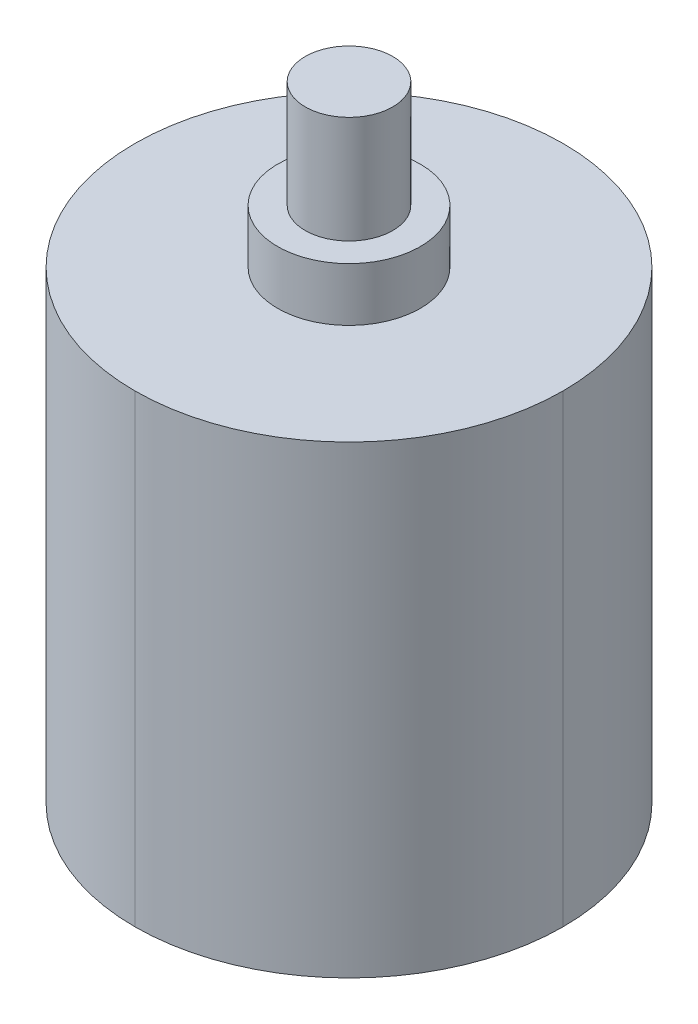
ISO-10303-21;
HEADER;
FILE_DESCRIPTION(('STEP AP214'),'2;1');
FILE_NAME('part.step','',(''),(''),'','','');
FILE_SCHEMA(('AUTOMOTIVE_DESIGN { 1 0 10303 214 1 1 1 1 }'));
ENDSEC;
DATA;
#1=APPLICATION_CONTEXT('core data for automotive mechanical design processes');
#2=APPLICATION_PROTOCOL_DEFINITION('international standard','automotive_design',2000,#1);
#3=PRODUCT_CONTEXT('',#1,'mechanical');
#4=PRODUCT('Part','Part','',(#3));
#5=PRODUCT_RELATED_PRODUCT_CATEGORY('part','',(#4));
#6=PRODUCT_DEFINITION_FORMATION('','',#4);
#7=PRODUCT_DEFINITION_CONTEXT('part definition',#1,'design');
#8=PRODUCT_DEFINITION('design','',#6,#7);
#9=PRODUCT_DEFINITION_SHAPE('','',#8);
#10=(LENGTH_UNIT() NAMED_UNIT(*) SI_UNIT(.MILLI.,.METRE.));
#11=(NAMED_UNIT(*) PLANE_ANGLE_UNIT() SI_UNIT($,.RADIAN.));
#12=(NAMED_UNIT(*) SI_UNIT($,.STERADIAN.) SOLID_ANGLE_UNIT());
#13=UNCERTAINTY_MEASURE_WITH_UNIT(LENGTH_MEASURE(1.E-05),#10,'distance_accuracy_value','');
#14=(GEOMETRIC_REPRESENTATION_CONTEXT(3) GLOBAL_UNCERTAINTY_ASSIGNED_CONTEXT((#13)) GLOBAL_UNIT_ASSIGNED_CONTEXT((#10,
#11,#12)) REPRESENTATION_CONTEXT('',''));
#15=CARTESIAN_POINT('',(0.,0.,0.));
#16=DIRECTION('',(0.,0.,1.));
#17=DIRECTION('',(1.,0.,0.));
#18=AXIS2_PLACEMENT_3D('',#15,#16,#17);
#19=CARTESIAN_POINT('',(0.,33.02,0.));
#20=DIRECTION('',(0.,1.,0.));
#21=DIRECTION('',(0.,0.,1.));
#22=AXIS2_PLACEMENT_3D('',#19,#20,#21);
#23=PLANE('',#22);
#24=CARTESIAN_POINT('',(-15.24,33.02,-15.24));
#25=DIRECTION('',(0.,1.,0.));
#26=DIRECTION('',(0.,0.,1.));
#27=AXIS2_PLACEMENT_3D('',#24,#25,#26);
#28=CIRCLE('',#27,5.08);
#29=CARTESIAN_POINT('',(-15.24,33.02,-20.32));
#30=VERTEX_POINT('',#29);
#31=EDGE_CURVE('E137',#30,#30,#28,.T.);
#32=ORIENTED_EDGE('',*,*,#31,.F.);
#33=EDGE_LOOP('',(#32));
#34=FACE_BOUND('',#33,.T.);
#35=CARTESIAN_POINT('',(-15.24,33.02,-15.24));
#36=DIRECTION('',(0.,1.,0.));
#37=DIRECTION('',(0.,0.,1.));
#38=AXIS2_PLACEMENT_3D('',#35,#36,#37);
#39=CIRCLE('',#38,15.24);
#40=CARTESIAN_POINT('',(0.,33.02,-15.24));
#41=VERTEX_POINT('',#40);
#42=CARTESIAN_POINT('',(-15.24,33.02,-30.48));
#43=VERTEX_POINT('',#42);
#44=EDGE_CURVE('E55',#41,#43,#39,.T.);
#45=ORIENTED_EDGE('',*,*,#44,.T.);
#46=CARTESIAN_POINT('',(-15.24,33.02,-15.24));
#47=DIRECTION('',(0.,1.,0.));
#48=DIRECTION('',(0.,0.,1.));
#49=AXIS2_PLACEMENT_3D('',#46,#47,#48);
#50=CIRCLE('',#49,15.24);
#51=CARTESIAN_POINT('',(-30.48,33.02,-15.24));
#52=VERTEX_POINT('',#51);
#53=EDGE_CURVE('E11',#43,#52,#50,.T.);
#54=ORIENTED_EDGE('',*,*,#53,.T.);
#55=CARTESIAN_POINT('',(-15.24,33.02,-15.24));
#56=DIRECTION('',(0.,1.,0.));
#57=DIRECTION('',(0.,0.,1.));
#58=AXIS2_PLACEMENT_3D('',#55,#56,#57);
#59=CIRCLE('',#58,15.24);
#60=CARTESIAN_POINT('',(-15.24,33.02,0.));
#61=VERTEX_POINT('',#60);
#62=EDGE_CURVE('E62',#52,#61,#59,.T.);
#63=ORIENTED_EDGE('',*,*,#62,.T.);
#64=CARTESIAN_POINT('',(-15.24,33.02,-15.24));
#65=DIRECTION('',(0.,1.,0.));
#66=DIRECTION('',(0.,0.,1.));
#67=AXIS2_PLACEMENT_3D('',#64,#65,#66);
#68=CIRCLE('',#67,15.24);
#69=EDGE_CURVE('E130',#61,#41,#68,.T.);
#70=ORIENTED_EDGE('',*,*,#69,.T.);
#71=EDGE_LOOP('',(#45,#54,#63,#70));
#72=FACE_BOUND('',#71,.T.);
#73=ADVANCED_FACE('F45',(#34,#72),#23,.T.);
#74=CARTESIAN_POINT('',(0.,0.,0.));
#75=DIRECTION('',(0.,1.,0.));
#76=DIRECTION('',(0.,0.,1.));
#77=AXIS2_PLACEMENT_3D('',#74,#75,#76);
#78=PLANE('',#77);
#79=CARTESIAN_POINT('',(-15.24,0.,-15.24));
#80=DIRECTION('',(0.,-1.,0.));
#81=DIRECTION('',(0.,0.,-1.));
#82=AXIS2_PLACEMENT_3D('',#79,#80,#81);
#83=CIRCLE('',#82,10.8585);
#84=CARTESIAN_POINT('',(-15.24,0.,-26.0985));
#85=VERTEX_POINT('',#84);
#86=EDGE_CURVE('E113',#85,#85,#83,.T.);
#87=ORIENTED_EDGE('',*,*,#86,.F.);
#88=EDGE_LOOP('',(#87));
#89=FACE_BOUND('',#88,.T.);
#90=CARTESIAN_POINT('',(-15.24,0.,-15.24));
#91=DIRECTION('',(0.,1.,0.));
#92=DIRECTION('',(0.,0.,1.));
#93=AXIS2_PLACEMENT_3D('',#90,#91,#92);
#94=CIRCLE('',#93,15.24);
#95=CARTESIAN_POINT('',(-15.24,0.,0.));
#96=VERTEX_POINT('',#95);
#97=CARTESIAN_POINT('',(-30.48,0.,-15.24));
#98=VERTEX_POINT('',#97);
#99=EDGE_CURVE('E100',#96,#98,#94,.F.);
#100=ORIENTED_EDGE('',*,*,#99,.T.);
#101=CARTESIAN_POINT('',(-15.24,0.,-15.24));
#102=DIRECTION('',(0.,1.,0.));
#103=DIRECTION('',(0.,0.,1.));
#104=AXIS2_PLACEMENT_3D('',#101,#102,#103);
#105=CIRCLE('',#104,15.24);
#106=CARTESIAN_POINT('',(-15.24,0.,-30.48));
#107=VERTEX_POINT('',#106);
#108=EDGE_CURVE('E95',#98,#107,#105,.F.);
#109=ORIENTED_EDGE('',*,*,#108,.T.);
#110=CARTESIAN_POINT('',(-15.24,0.,-15.24));
#111=DIRECTION('',(0.,1.,0.));
#112=DIRECTION('',(0.,0.,1.));
#113=AXIS2_PLACEMENT_3D('',#110,#111,#112);
#114=CIRCLE('',#113,15.24);
#115=CARTESIAN_POINT('',(0.,0.,-15.24));
#116=VERTEX_POINT('',#115);
#117=EDGE_CURVE('E90',#107,#116,#114,.F.);
#118=ORIENTED_EDGE('',*,*,#117,.T.);
#119=CARTESIAN_POINT('',(-15.24,0.,-15.24));
#120=DIRECTION('',(0.,1.,0.));
#121=DIRECTION('',(0.,0.,1.));
#122=AXIS2_PLACEMENT_3D('',#119,#120,#121);
#123=CIRCLE('',#122,15.24);
#124=EDGE_CURVE('E93',#116,#96,#123,.F.);
#125=ORIENTED_EDGE('',*,*,#124,.T.);
#126=EDGE_LOOP('',(#100,#109,#118,#125));
#127=FACE_BOUND('',#126,.T.);
#128=ADVANCED_FACE('F92',(#89,#127),#78,.F.);
#129=CARTESIAN_POINT('',(-15.24,36.83,-15.24));
#130=DIRECTION('',(0.,-1.,0.));
#131=DIRECTION('',(0.,0.,-1.));
#132=AXIS2_PLACEMENT_3D('',#129,#130,#131);
#133=CYLINDRICAL_SURFACE('',#132,5.08);
#134=CARTESIAN_POINT('',(-15.24,36.83,-15.24));
#135=DIRECTION('',(0.,1.,0.));
#136=DIRECTION('',(0.,0.,1.));
#137=AXIS2_PLACEMENT_3D('',#134,#135,#136);
#138=CIRCLE('',#137,5.08);
#139=CARTESIAN_POINT('',(-15.24,36.83,-20.32));
#140=VERTEX_POINT('',#139);
#141=EDGE_CURVE('E141',#140,#140,#138,.T.);
#142=CARTESIAN_POINT('',(-15.24,36.83,-20.32));
#143=CARTESIAN_POINT('',(-15.24,36.7903125,-20.32));
#144=CARTESIAN_POINT('',(-15.24,36.750625,-20.32));
#145=CARTESIAN_POINT('',(-15.24,36.67125,-20.32));
#146=CARTESIAN_POINT('',(-15.24,36.6315625,-20.32));
#147=CARTESIAN_POINT('',(-15.24,36.5521875,-20.32));
#148=CARTESIAN_POINT('',(-15.24,36.5125,-20.32));
#149=CARTESIAN_POINT('',(-15.24,36.433125,-20.32));
#150=CARTESIAN_POINT('',(-15.24,36.3934375,-20.32));
#151=CARTESIAN_POINT('',(-15.24,36.3140625,-20.32));
#152=CARTESIAN_POINT('',(-15.24,36.274375,-20.32));
#153=CARTESIAN_POINT('',(-15.24,36.195,-20.32));
#154=CARTESIAN_POINT('',(-15.24,36.1553125,-20.32));
#155=CARTESIAN_POINT('',(-15.24,36.0759375,-20.32));
#156=CARTESIAN_POINT('',(-15.24,36.03625,-20.32));
#157=CARTESIAN_POINT('',(-15.24,35.956875,-20.32));
#158=CARTESIAN_POINT('',(-15.24,35.9171875,-20.32));
#159=CARTESIAN_POINT('',(-15.24,35.8378125,-20.32));
#160=CARTESIAN_POINT('',(-15.24,35.798125,-20.32));
#161=CARTESIAN_POINT('',(-15.24,35.71875,-20.32));
#162=CARTESIAN_POINT('',(-15.24,35.6790625,-20.32));
#163=CARTESIAN_POINT('',(-15.24,35.5996875,-20.32));
#164=CARTESIAN_POINT('',(-15.24,35.56,-20.32));
#165=CARTESIAN_POINT('',(-15.24,35.480625,-20.32));
#166=CARTESIAN_POINT('',(-15.24,35.4409375,-20.32));
#167=CARTESIAN_POINT('',(-15.24,35.3615625,-20.32));
#168=CARTESIAN_POINT('',(-15.24,35.321875,-20.32));
#169=CARTESIAN_POINT('',(-15.24,35.2425,-20.32));
#170=CARTESIAN_POINT('',(-15.24,35.2028125,-20.32));
#171=CARTESIAN_POINT('',(-15.24,35.1234375,-20.32));
#172=CARTESIAN_POINT('',(-15.24,35.08375,-20.32));
#173=CARTESIAN_POINT('',(-15.24,35.004375,-20.32));
#174=CARTESIAN_POINT('',(-15.24,34.9646875,-20.32));
#175=CARTESIAN_POINT('',(-15.24,34.8853125,-20.32));
#176=CARTESIAN_POINT('',(-15.24,34.845625,-20.32));
#177=CARTESIAN_POINT('',(-15.24,34.76625,-20.32));
#178=CARTESIAN_POINT('',(-15.24,34.7265625,-20.32));
#179=CARTESIAN_POINT('',(-15.24,34.6471875,-20.32));
#180=CARTESIAN_POINT('',(-15.24,34.6075,-20.32));
#181=CARTESIAN_POINT('',(-15.24,34.528125,-20.32));
#182=CARTESIAN_POINT('',(-15.24,34.4884375,-20.32));
#183=CARTESIAN_POINT('',(-15.24,34.4090625,-20.32));
#184=CARTESIAN_POINT('',(-15.24,34.369375,-20.32));
#185=CARTESIAN_POINT('',(-15.24,34.29,-20.32));
#186=CARTESIAN_POINT('',(-15.24,34.2503125,-20.32));
#187=CARTESIAN_POINT('',(-15.24,34.1709375,-20.32));
#188=CARTESIAN_POINT('',(-15.24,34.13125,-20.32));
#189=CARTESIAN_POINT('',(-15.24,34.051875,-20.32));
#190=CARTESIAN_POINT('',(-15.24,34.0121875,-20.32));
#191=CARTESIAN_POINT('',(-15.24,33.9328125,-20.32));
#192=CARTESIAN_POINT('',(-15.24,33.893125,-20.32));
#193=CARTESIAN_POINT('',(-15.24,33.81375,-20.32));
#194=CARTESIAN_POINT('',(-15.24,33.7740625,-20.32));
#195=CARTESIAN_POINT('',(-15.24,33.6946875,-20.32));
#196=CARTESIAN_POINT('',(-15.24,33.655,-20.32));
#197=CARTESIAN_POINT('',(-15.24,33.575625,-20.32));
#198=CARTESIAN_POINT('',(-15.24,33.5359375,-20.32));
#199=CARTESIAN_POINT('',(-15.24,33.4565625,-20.32));
#200=CARTESIAN_POINT('',(-15.24,33.416875,-20.32));
#201=CARTESIAN_POINT('',(-15.24,33.3375,-20.32));
#202=CARTESIAN_POINT('',(-15.24,33.2978125,-20.32));
#203=CARTESIAN_POINT('',(-15.24,33.2184375,-20.32));
#204=CARTESIAN_POINT('',(-15.24,33.17875,-20.32));
#205=CARTESIAN_POINT('',(-15.24,33.099375,-20.32));
#206=CARTESIAN_POINT('',(-15.24,33.0596875,-20.32));
#207=CARTESIAN_POINT('',(-15.24,33.02,-20.32));
#208=B_SPLINE_CURVE_WITH_KNOTS('',3,(#142,#143,#144,#145,#146,#147,#148,#149,#150,#151,#152,
#153,#154,#155,#156,#157,#158,#159,#160,#161,#162,#163,#164,#165,#166,#167,#168,#169,#170,#171,
#172,#173,#174,#175,#176,#177,#178,#179,#180,#181,#182,#183,#184,#185,#186,#187,#188,#189,#190,
#191,#192,#193,#194,#195,#196,#197,#198,#199,#200,#201,#202,#203,#204,#205,#206,#207),
.UNSPECIFIED.,.F.,.F.,(4,2,2,2,2,2,2,2,2,2,2,2,2,2,2,2,2,2,2,2,2,2,2,2,2,2,2,2,2,2,2,2,4),(0.,
0.119062500000003,0.238125000000006,0.357187500000002,0.476250000000004,0.5953125,
0.714375000000003,0.833437500000006,0.952500000000002,1.0715625,1.190625,1.3096875,
1.42875000000001,1.5478125,1.66687500000001,1.7859375,1.905,2.02406250000001,2.143125,
2.26218750000001,2.38125,2.5003125,2.61937500000001,2.7384375,2.85750000000001,2.9765625,
3.095625,3.2146875,3.33375,3.45281250000001,3.571875,3.6909375,3.81),.UNSPECIFIED.);
#209=EDGE_CURVE('BSEAM166',#140,#30,#208,.T.);
#210=ORIENTED_EDGE('',*,*,#141,.F.);
#211=ORIENTED_EDGE('',*,*,#31,.T.);
#212=ORIENTED_EDGE('',*,*,#209,.T.);
#213=ORIENTED_EDGE('',*,*,#209,.F.);
#214=EDGE_LOOP('',(#210,#212,#211,#213));
#215=FACE_BOUND('',#214,.T.);
#216=ADVANCED_FACE('F166',(#215),#133,.T.);
#217=CARTESIAN_POINT('',(-15.24,36.83,-15.24));
#218=DIRECTION('',(0.,1.,0.));
#219=DIRECTION('',(0.,0.,1.));
#220=AXIS2_PLACEMENT_3D('',#217,#218,#219);
#221=PLANE('',#220);
#222=CARTESIAN_POINT('',(-15.24,36.83,-15.24));
#223=DIRECTION('',(0.,1.,0.));
#224=DIRECTION('',(0.,0.,1.));
#225=AXIS2_PLACEMENT_3D('',#222,#223,#224);
#226=CIRCLE('',#225,3.1115);
#227=CARTESIAN_POINT('',(-15.24,36.83,-18.3515));
#228=VERTEX_POINT('',#227);
#229=EDGE_CURVE('E109',#228,#228,#226,.T.);
#230=ORIENTED_EDGE('',*,*,#229,.F.);
#231=EDGE_LOOP('',(#230));
#232=FACE_BOUND('',#231,.T.);
#233=ORIENTED_EDGE('',*,*,#141,.T.);
#234=EDGE_LOOP('',(#233));
#235=FACE_BOUND('',#234,.T.);
#236=ADVANCED_FACE('F173',(#232,#235),#221,.T.);
#237=CARTESIAN_POINT('',(-15.24,44.45,-15.24));
#238=DIRECTION('',(0.,-1.,0.));
#239=DIRECTION('',(0.,0.,-1.));
#240=AXIS2_PLACEMENT_3D('',#237,#238,#239);
#241=CYLINDRICAL_SURFACE('',#240,3.1115);
#242=CARTESIAN_POINT('',(-15.24,44.45,-15.24));
#243=DIRECTION('',(0.,1.,0.));
#244=DIRECTION('',(0.,0.,1.));
#245=AXIS2_PLACEMENT_3D('',#242,#243,#244);
#246=CIRCLE('',#245,3.1115);
#247=CARTESIAN_POINT('',(-15.24,44.45,-18.3515));
#248=VERTEX_POINT('',#247);
#249=EDGE_CURVE('E145',#248,#248,#246,.T.);
#250=CARTESIAN_POINT('',(-15.24,44.45,-18.3515));
#251=CARTESIAN_POINT('',(-15.24,44.370625,-18.3515));
#252=CARTESIAN_POINT('',(-15.24,44.29125,-18.3515));
#253=CARTESIAN_POINT('',(-15.24,44.1325,-18.3515));
#254=CARTESIAN_POINT('',(-15.24,44.053125,-18.3515));
#255=CARTESIAN_POINT('',(-15.24,43.894375,-18.3515));
#256=CARTESIAN_POINT('',(-15.24,43.815,-18.3515));
#257=CARTESIAN_POINT('',(-15.24,43.65625,-18.3515));
#258=CARTESIAN_POINT('',(-15.24,43.576875,-18.3515));
#259=CARTESIAN_POINT('',(-15.24,43.418125,-18.3515));
#260=CARTESIAN_POINT('',(-15.24,43.33875,-18.3515));
#261=CARTESIAN_POINT('',(-15.24,43.18,-18.3515));
#262=CARTESIAN_POINT('',(-15.24,43.100625,-18.3515));
#263=CARTESIAN_POINT('',(-15.24,42.941875,-18.3515));
#264=CARTESIAN_POINT('',(-15.24,42.8625,-18.3515));
#265=CARTESIAN_POINT('',(-15.24,42.70375,-18.3515));
#266=CARTESIAN_POINT('',(-15.24,42.624375,-18.3515));
#267=CARTESIAN_POINT('',(-15.24,42.465625,-18.3515));
#268=CARTESIAN_POINT('',(-15.24,42.38625,-18.3515));
#269=CARTESIAN_POINT('',(-15.24,42.2275,-18.3515));
#270=CARTESIAN_POINT('',(-15.24,42.148125,-18.3515));
#271=CARTESIAN_POINT('',(-15.24,41.989375,-18.3515));
#272=CARTESIAN_POINT('',(-15.24,41.91,-18.3515));
#273=CARTESIAN_POINT('',(-15.24,41.75125,-18.3515));
#274=CARTESIAN_POINT('',(-15.24,41.671875,-18.3515));
#275=CARTESIAN_POINT('',(-15.24,41.513125,-18.3515));
#276=CARTESIAN_POINT('',(-15.24,41.43375,-18.3515));
#277=CARTESIAN_POINT('',(-15.24,41.275,-18.3515));
#278=CARTESIAN_POINT('',(-15.24,41.195625,-18.3515));
#279=CARTESIAN_POINT('',(-15.24,41.036875,-18.3515));
#280=CARTESIAN_POINT('',(-15.24,40.9575,-18.3515));
#281=CARTESIAN_POINT('',(-15.24,40.79875,-18.3515));
#282=CARTESIAN_POINT('',(-15.24,40.719375,-18.3515));
#283=CARTESIAN_POINT('',(-15.24,40.560625,-18.3515));
#284=CARTESIAN_POINT('',(-15.24,40.48125,-18.3515));
#285=CARTESIAN_POINT('',(-15.24,40.3225,-18.3515));
#286=CARTESIAN_POINT('',(-15.24,40.243125,-18.3515));
#287=CARTESIAN_POINT('',(-15.24,40.084375,-18.3515));
#288=CARTESIAN_POINT('',(-15.24,40.005,-18.3515));
#289=CARTESIAN_POINT('',(-15.24,39.84625,-18.3515));
#290=CARTESIAN_POINT('',(-15.24,39.766875,-18.3515));
#291=CARTESIAN_POINT('',(-15.24,39.608125,-18.3515));
#292=CARTESIAN_POINT('',(-15.24,39.52875,-18.3515));
#293=CARTESIAN_POINT('',(-15.24,39.37,-18.3515));
#294=CARTESIAN_POINT('',(-15.24,39.290625,-18.3515));
#295=CARTESIAN_POINT('',(-15.24,39.131875,-18.3515));
#296=CARTESIAN_POINT('',(-15.24,39.0525,-18.3515));
#297=CARTESIAN_POINT('',(-15.24,38.89375,-18.3515));
#298=CARTESIAN_POINT('',(-15.24,38.814375,-18.3515));
#299=CARTESIAN_POINT('',(-15.24,38.655625,-18.3515));
#300=CARTESIAN_POINT('',(-15.24,38.57625,-18.3515));
#301=CARTESIAN_POINT('',(-15.24,38.4175,-18.3515));
#302=CARTESIAN_POINT('',(-15.24,38.338125,-18.3515));
#303=CARTESIAN_POINT('',(-15.24,38.179375,-18.3515));
#304=CARTESIAN_POINT('',(-15.24,38.1,-18.3515));
#305=CARTESIAN_POINT('',(-15.24,37.94125,-18.3515));
#306=CARTESIAN_POINT('',(-15.24,37.861875,-18.3515));
#307=CARTESIAN_POINT('',(-15.24,37.703125,-18.3515));
#308=CARTESIAN_POINT('',(-15.24,37.62375,-18.3515));
#309=CARTESIAN_POINT('',(-15.24,37.465,-18.3515));
#310=CARTESIAN_POINT('',(-15.24,37.385625,-18.3515));
#311=CARTESIAN_POINT('',(-15.24,37.226875,-18.3515));
#312=CARTESIAN_POINT('',(-15.24,37.1475,-18.3515));
#313=CARTESIAN_POINT('',(-15.24,36.98875,-18.3515));
#314=CARTESIAN_POINT('',(-15.24,36.909375,-18.3515));
#315=CARTESIAN_POINT('',(-15.24,36.83,-18.3515));
#316=B_SPLINE_CURVE_WITH_KNOTS('',3,(#250,#251,#252,#253,#254,#255,#256,#257,#258,#259,#260,
#261,#262,#263,#264,#265,#266,#267,#268,#269,#270,#271,#272,#273,#274,#275,#276,#277,#278,#279,
#280,#281,#282,#283,#284,#285,#286,#287,#288,#289,#290,#291,#292,#293,#294,#295,#296,#297,#298,
#299,#300,#301,#302,#303,#304,#305,#306,#307,#308,#309,#310,#311,#312,#313,#314,#315),
.UNSPECIFIED.,.F.,.F.,(4,2,2,2,2,2,2,2,2,2,2,2,2,2,2,2,2,2,2,2,2,2,2,2,2,2,2,2,2,2,2,2,4),(0.,
0.238125000000006,0.476250000000004,0.714375000000003,0.952500000000002,1.190625,
1.42875000000001,1.66687500000001,1.905,2.143125,2.38125,2.61937500000001,2.85750000000001,
3.095625,3.33375,3.571875,3.81000000000001,4.04812500000001,4.28625000000001,4.524375,4.7625,
5.00062500000001,5.23875000000001,5.47687500000001,5.71500000000001,5.953125,6.19125000000001,
6.42937500000001,6.66750000000001,6.90562500000001,7.14375,7.381875,7.62000000000001),.UNSPECIFIED.);
#317=EDGE_CURVE('BSEAM196',#248,#228,#316,.T.);
#318=ORIENTED_EDGE('',*,*,#249,.F.);
#319=ORIENTED_EDGE('',*,*,#229,.T.);
#320=ORIENTED_EDGE('',*,*,#317,.T.);
#321=ORIENTED_EDGE('',*,*,#317,.F.);
#322=EDGE_LOOP('',(#318,#320,#319,#321));
#323=FACE_BOUND('',#322,.T.);
#324=ADVANCED_FACE('F196',(#323),#241,.T.);
#325=CARTESIAN_POINT('',(-15.24,44.45,-15.24));
#326=DIRECTION('',(0.,1.,0.));
#327=DIRECTION('',(0.,0.,1.));
#328=AXIS2_PLACEMENT_3D('',#325,#326,#327);
#329=PLANE('',#328);
#330=ORIENTED_EDGE('',*,*,#249,.T.);
#331=EDGE_LOOP('',(#330));
#332=FACE_BOUND('',#331,.T.);
#333=ADVANCED_FACE('F161',(#332),#329,.T.);
#334=CARTESIAN_POINT('',(-15.24,25.4,-15.24));
#335=DIRECTION('',(0.,-1.,0.));
#336=DIRECTION('',(0.,0.,-1.));
#337=AXIS2_PLACEMENT_3D('',#334,#335,#336);
#338=CYLINDRICAL_SURFACE('',#337,10.8585);
#339=CARTESIAN_POINT('',(-15.24,25.4,-15.24));
#340=DIRECTION('',(0.,-1.,0.));
#341=DIRECTION('',(0.,0.,-1.));
#342=AXIS2_PLACEMENT_3D('',#339,#340,#341);
#343=CIRCLE('',#342,10.8585);
#344=CARTESIAN_POINT('',(-15.24,25.4,-26.0985));
#345=VERTEX_POINT('',#344);
#346=EDGE_CURVE('E117',#345,#345,#343,.T.);
#347=ORIENTED_EDGE('',*,*,#346,.F.);
#348=EDGE_LOOP('',(#347));
#349=FACE_BOUND('',#348,.T.);
#350=ORIENTED_EDGE('',*,*,#86,.T.);
#351=EDGE_LOOP('',(#350));
#352=FACE_BOUND('',#351,.T.);
#353=ADVANCED_FACE('F158',(#349,#352),#338,.F.);
#354=CARTESIAN_POINT('',(-15.24,25.4,-15.24));
#355=DIRECTION('',(0.,-1.,0.));
#356=DIRECTION('',(0.,0.,-1.));
#357=AXIS2_PLACEMENT_3D('',#354,#355,#356);
#358=PLANE('',#357);
#359=ORIENTED_EDGE('',*,*,#346,.T.);
#360=EDGE_LOOP('',(#359));
#361=FACE_BOUND('',#360,.T.);
#362=ADVANCED_FACE('F156',(#361),#358,.T.);
#363=CARTESIAN_POINT('',(-15.24,33.02,-15.24));
#364=DIRECTION('',(0.,-1.,0.));
#365=DIRECTION('',(0.,0.,-1.));
#366=AXIS2_PLACEMENT_3D('',#363,#364,#365);
#367=CYLINDRICAL_SURFACE('',#366,15.24);
#368=DIRECTION('',(0.,-1.,0.));
#369=VECTOR('',#368,1.);
#370=CARTESIAN_POINT('',(-15.24,33.02,0.));
#371=LINE('',#370,#369);
#372=EDGE_CURVE('E106',#96,#61,#371,.F.);
#373=ORIENTED_EDGE('',*,*,#372,.F.);
#374=ORIENTED_EDGE('',*,*,#124,.F.);
#375=DIRECTION('',(0.,-1.,0.));
#376=VECTOR('',#375,1.);
#377=CARTESIAN_POINT('',(0.,33.02,-15.24));
#378=LINE('',#377,#376);
#379=EDGE_CURVE('E49',#41,#116,#378,.T.);
#380=ORIENTED_EDGE('',*,*,#379,.F.);
#381=ORIENTED_EDGE('',*,*,#69,.F.);
#382=EDGE_LOOP('',(#373,#374,#380,#381));
#383=FACE_BOUND('',#382,.T.);
#384=ADVANCED_FACE('F47',(#383),#367,.T.);
#385=CARTESIAN_POINT('',(-15.24,33.02,-15.24));
#386=DIRECTION('',(0.,-1.,0.));
#387=DIRECTION('',(0.,0.,-1.));
#388=AXIS2_PLACEMENT_3D('',#385,#386,#387);
#389=CYLINDRICAL_SURFACE('',#388,15.24);
#390=ORIENTED_EDGE('',*,*,#379,.T.);
#391=ORIENTED_EDGE('',*,*,#117,.F.);
#392=DIRECTION('',(0.,-1.,0.));
#393=VECTOR('',#392,1.);
#394=CARTESIAN_POINT('',(-15.24,33.02,-30.48));
#395=LINE('',#394,#393);
#396=EDGE_CURVE('E119',#43,#107,#395,.T.);
#397=ORIENTED_EDGE('',*,*,#396,.F.);
#398=ORIENTED_EDGE('',*,*,#44,.F.);
#399=EDGE_LOOP('',(#390,#391,#397,#398));
#400=FACE_BOUND('',#399,.T.);
#401=ADVANCED_FACE('F111',(#400),#389,.T.);
#402=CARTESIAN_POINT('',(-15.24,33.02,-15.24));
#403=DIRECTION('',(0.,-1.,0.));
#404=DIRECTION('',(0.,0.,-1.));
#405=AXIS2_PLACEMENT_3D('',#402,#403,#404);
#406=CYLINDRICAL_SURFACE('',#405,15.24);
#407=ORIENTED_EDGE('',*,*,#372,.T.);
#408=ORIENTED_EDGE('',*,*,#62,.F.);
#409=DIRECTION('',(0.,-1.,0.));
#410=VECTOR('',#409,1.);
#411=CARTESIAN_POINT('',(-30.48,33.02,-15.24));
#412=LINE('',#411,#410);
#413=EDGE_CURVE('E70',#98,#52,#412,.F.);
#414=ORIENTED_EDGE('',*,*,#413,.F.);
#415=ORIENTED_EDGE('',*,*,#99,.F.);
#416=EDGE_LOOP('',(#407,#408,#414,#415));
#417=FACE_BOUND('',#416,.T.);
#418=ADVANCED_FACE('F182',(#417),#406,.T.);
#419=CARTESIAN_POINT('',(-15.24,33.02,-15.24));
#420=DIRECTION('',(0.,-1.,0.));
#421=DIRECTION('',(0.,0.,-1.));
#422=AXIS2_PLACEMENT_3D('',#419,#420,#421);
#423=CYLINDRICAL_SURFACE('',#422,15.24);
#424=ORIENTED_EDGE('',*,*,#53,.F.);
#425=ORIENTED_EDGE('',*,*,#396,.T.);
#426=ORIENTED_EDGE('',*,*,#108,.F.);
#427=ORIENTED_EDGE('',*,*,#413,.T.);
#428=EDGE_LOOP('',(#424,#425,#426,#427));
#429=FACE_BOUND('',#428,.T.);
#430=ADVANCED_FACE('F179',(#429),#423,.T.);
#431=CLOSED_SHELL('',(#73,#128,#216,#236,#324,#333,#353,#362,#384,#401,#418,#430));
#432=MANIFOLD_SOLID_BREP('B2',#431);
#433=ADVANCED_BREP_SHAPE_REPRESENTATION('',(#18,#432),#14);
#434=SHAPE_DEFINITION_REPRESENTATION(#9,#433);
ENDSEC;
END-ISO-10303-21;
